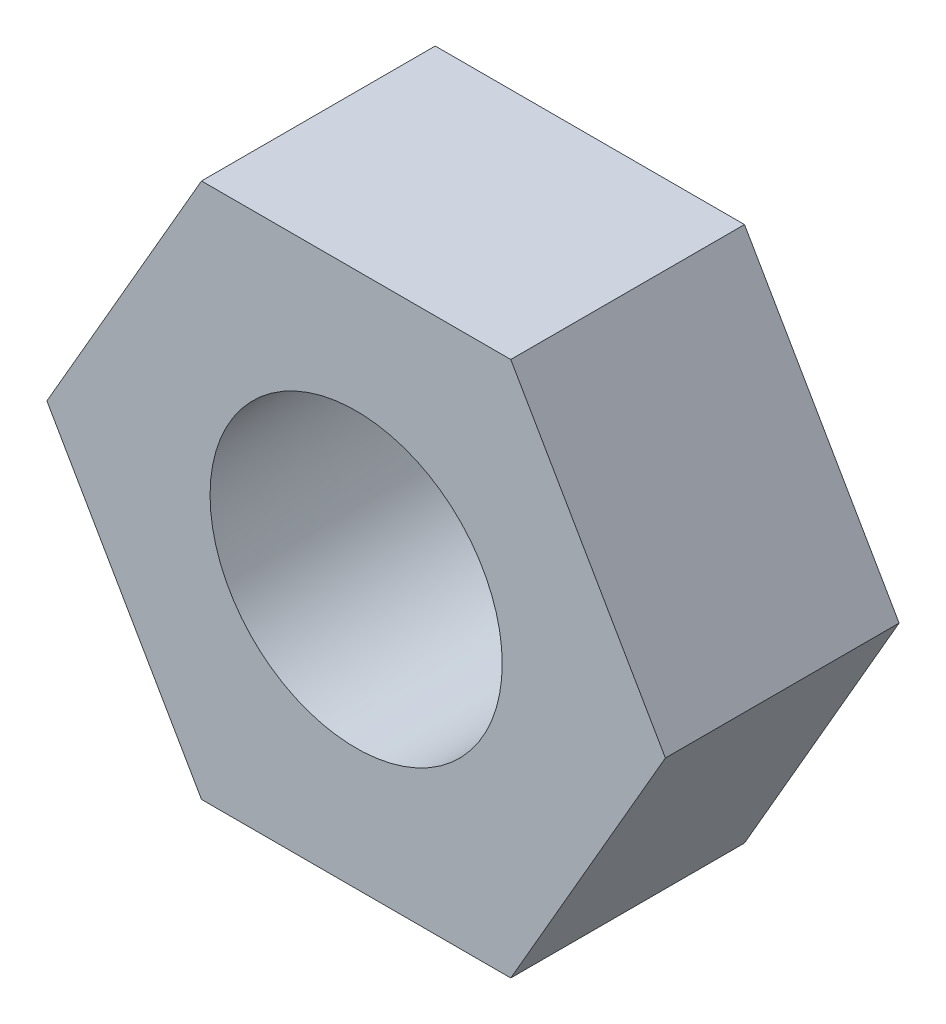
ISO-10303-21;
HEADER;
FILE_DESCRIPTION(('STEP AP214'),'2;1');
FILE_NAME('part.step','',(''),(''),'','','');
FILE_SCHEMA(('AUTOMOTIVE_DESIGN { 1 0 10303 214 1 1 1 1 }'));
ENDSEC;
DATA;
#1=APPLICATION_CONTEXT('core data for automotive mechanical design processes');
#2=APPLICATION_PROTOCOL_DEFINITION('international standard','automotive_design',2000,#1);
#3=PRODUCT_CONTEXT('',#1,'mechanical');
#4=PRODUCT('Part','Part','',(#3));
#5=PRODUCT_RELATED_PRODUCT_CATEGORY('part','',(#4));
#6=PRODUCT_DEFINITION_FORMATION('','',#4);
#7=PRODUCT_DEFINITION_CONTEXT('part definition',#1,'design');
#8=PRODUCT_DEFINITION('design','',#6,#7);
#9=PRODUCT_DEFINITION_SHAPE('','',#8);
#10=(LENGTH_UNIT() NAMED_UNIT(*) SI_UNIT(.MILLI.,.METRE.));
#11=(NAMED_UNIT(*) PLANE_ANGLE_UNIT() SI_UNIT($,.RADIAN.));
#12=(NAMED_UNIT(*) SI_UNIT($,.STERADIAN.) SOLID_ANGLE_UNIT());
#13=UNCERTAINTY_MEASURE_WITH_UNIT(LENGTH_MEASURE(1.E-05),#10,'distance_accuracy_value','');
#14=(GEOMETRIC_REPRESENTATION_CONTEXT(3) GLOBAL_UNCERTAINTY_ASSIGNED_CONTEXT((#13)) GLOBAL_UNIT_ASSIGNED_CONTEXT((#10,
#11,#12)) REPRESENTATION_CONTEXT('',''));
#15=CARTESIAN_POINT('',(0.,0.,0.));
#16=DIRECTION('',(0.,0.,1.));
#17=DIRECTION('',(1.,0.,0.));
#18=AXIS2_PLACEMENT_3D('',#15,#16,#17);
#19=CARTESIAN_POINT('',(0.,0.,2.4));
#20=DIRECTION('',(0.,0.,1.));
#21=DIRECTION('',(1.,0.,0.));
#22=AXIS2_PLACEMENT_3D('',#19,#20,#21);
#23=PLANE('',#22);
#24=DIRECTION('',(0.5,0.866025403784439,0.));
#25=VECTOR('',#24,1.);
#26=CARTESIAN_POINT('',(1.58771324027147,-2.75,2.4));
#27=LINE('',#26,#25);
#28=CARTESIAN_POINT('',(1.58771324027147,-2.75,2.4));
#29=VERTEX_POINT('',#28);
#30=CARTESIAN_POINT('',(3.17542648054294,0.,2.4));
#31=VERTEX_POINT('',#30);
#32=EDGE_CURVE('E140',#29,#31,#27,.T.);
#33=ORIENTED_EDGE('',*,*,#32,.T.);
#34=DIRECTION('',(-0.5,0.866025403784439,0.));
#35=VECTOR('',#34,1.);
#36=CARTESIAN_POINT('',(3.17542648054294,0.,2.4));
#37=LINE('',#36,#35);
#38=CARTESIAN_POINT('',(1.58771324027147,2.75,2.4));
#39=VERTEX_POINT('',#38);
#40=EDGE_CURVE('E91',#31,#39,#37,.T.);
#41=ORIENTED_EDGE('',*,*,#40,.T.);
#42=DIRECTION('',(-1.,0.,0.));
#43=VECTOR('',#42,1.);
#44=CARTESIAN_POINT('',(1.58771324027147,2.75,2.4));
#45=LINE('',#44,#43);
#46=CARTESIAN_POINT('',(-1.58771324027147,2.75,2.4));
#47=VERTEX_POINT('',#46);
#48=EDGE_CURVE('E108',#39,#47,#45,.T.);
#49=ORIENTED_EDGE('',*,*,#48,.T.);
#50=DIRECTION('',(-0.5,-0.866025403784438,0.));
#51=VECTOR('',#50,1.);
#52=CARTESIAN_POINT('',(-1.58771324027147,2.75,2.4));
#53=LINE('',#52,#51);
#54=CARTESIAN_POINT('',(-3.17542648054294,0.,2.4));
#55=VERTEX_POINT('',#54);
#56=EDGE_CURVE('E105',#47,#55,#53,.T.);
#57=ORIENTED_EDGE('',*,*,#56,.T.);
#58=DIRECTION('',(0.5,-0.866025403784439,0.));
#59=VECTOR('',#58,1.);
#60=CARTESIAN_POINT('',(-3.17542648054294,0.,2.4));
#61=LINE('',#60,#59);
#62=CARTESIAN_POINT('',(-1.58771324027147,-2.75,2.4));
#63=VERTEX_POINT('',#62);
#64=EDGE_CURVE('E106',#55,#63,#61,.T.);
#65=ORIENTED_EDGE('',*,*,#64,.T.);
#66=DIRECTION('',(1.,0.,0.));
#67=VECTOR('',#66,1.);
#68=CARTESIAN_POINT('',(-1.58771324027147,-2.75,2.4));
#69=LINE('',#68,#67);
#70=EDGE_CURVE('E59',#63,#29,#69,.T.);
#71=ORIENTED_EDGE('',*,*,#70,.T.);
#72=EDGE_LOOP('',(#33,#41,#49,#57,#65,#71));
#73=FACE_BOUND('',#72,.T.);
#74=CARTESIAN_POINT('',(0.,0.,2.4));
#75=DIRECTION('',(0.,0.,1.));
#76=DIRECTION('',(1.,0.,0.));
#77=AXIS2_PLACEMENT_3D('',#74,#75,#76);
#78=CIRCLE('',#77,1.5);
#79=CARTESIAN_POINT('',(1.5,0.,2.4));
#80=VERTEX_POINT('',#79);
#81=EDGE_CURVE('E127',#80,#80,#78,.T.);
#82=ORIENTED_EDGE('',*,*,#81,.F.);
#83=EDGE_LOOP('',(#82));
#84=FACE_BOUND('',#83,.T.);
#85=ADVANCED_FACE('F41',(#73,#84),#23,.T.);
#86=CARTESIAN_POINT('',(0.,0.,0.));
#87=DIRECTION('',(0.,0.,1.));
#88=DIRECTION('',(1.,0.,0.));
#89=AXIS2_PLACEMENT_3D('',#86,#87,#88);
#90=PLANE('',#89);
#91=DIRECTION('',(0.5,0.866025403784439,0.));
#92=VECTOR('',#91,1.);
#93=CARTESIAN_POINT('',(1.58771324027147,-2.75,0.));
#94=LINE('',#93,#92);
#95=CARTESIAN_POINT('',(1.58771324027147,-2.75,0.));
#96=VERTEX_POINT('',#95);
#97=CARTESIAN_POINT('',(3.17542648054294,0.,0.));
#98=VERTEX_POINT('',#97);
#99=EDGE_CURVE('E129',#96,#98,#94,.T.);
#100=ORIENTED_EDGE('',*,*,#99,.F.);
#101=DIRECTION('',(1.,0.,0.));
#102=VECTOR('',#101,1.);
#103=CARTESIAN_POINT('',(-1.58771324027147,-2.75,0.));
#104=LINE('',#103,#102);
#105=CARTESIAN_POINT('',(-1.58771324027147,-2.75,0.));
#106=VERTEX_POINT('',#105);
#107=EDGE_CURVE('E90',#106,#96,#104,.T.);
#108=ORIENTED_EDGE('',*,*,#107,.F.);
#109=DIRECTION('',(0.5,-0.866025403784439,0.));
#110=VECTOR('',#109,1.);
#111=CARTESIAN_POINT('',(-3.17542648054294,0.,0.));
#112=LINE('',#111,#110);
#113=CARTESIAN_POINT('',(-3.17542648054294,0.,0.));
#114=VERTEX_POINT('',#113);
#115=EDGE_CURVE('E84',#114,#106,#112,.T.);
#116=ORIENTED_EDGE('',*,*,#115,.F.);
#117=DIRECTION('',(-0.5,-0.866025403784438,0.));
#118=VECTOR('',#117,1.);
#119=CARTESIAN_POINT('',(-1.58771324027147,2.75,0.));
#120=LINE('',#119,#118);
#121=CARTESIAN_POINT('',(-1.58771324027147,2.75,0.));
#122=VERTEX_POINT('',#121);
#123=EDGE_CURVE('E116',#122,#114,#120,.T.);
#124=ORIENTED_EDGE('',*,*,#123,.F.);
#125=DIRECTION('',(-1.,0.,0.));
#126=VECTOR('',#125,1.);
#127=CARTESIAN_POINT('',(1.58771324027147,2.75,0.));
#128=LINE('',#127,#126);
#129=CARTESIAN_POINT('',(1.58771324027147,2.75,0.));
#130=VERTEX_POINT('',#129);
#131=EDGE_CURVE('E135',#130,#122,#128,.T.);
#132=ORIENTED_EDGE('',*,*,#131,.F.);
#133=DIRECTION('',(-0.5,0.866025403784439,0.));
#134=VECTOR('',#133,1.);
#135=CARTESIAN_POINT('',(3.17542648054294,0.,0.));
#136=LINE('',#135,#134);
#137=EDGE_CURVE('E128',#98,#130,#136,.T.);
#138=ORIENTED_EDGE('',*,*,#137,.F.);
#139=EDGE_LOOP('',(#100,#108,#116,#124,#132,#138));
#140=FACE_BOUND('',#139,.T.);
#141=CARTESIAN_POINT('',(0.,0.,0.));
#142=DIRECTION('',(0.,0.,1.));
#143=DIRECTION('',(1.,0.,0.));
#144=AXIS2_PLACEMENT_3D('',#141,#142,#143);
#145=CIRCLE('',#144,1.5);
#146=CARTESIAN_POINT('',(1.5,0.,0.));
#147=VERTEX_POINT('',#146);
#148=EDGE_CURVE('E229',#147,#147,#145,.T.);
#149=ORIENTED_EDGE('',*,*,#148,.T.);
#150=EDGE_LOOP('',(#149));
#151=FACE_BOUND('',#150,.T.);
#152=ADVANCED_FACE('F149',(#140,#151),#90,.F.);
#153=CARTESIAN_POINT('',(1.58771324027147,-2.75,2.4));
#154=DIRECTION('',(-0.866025403784439,0.5,0.));
#155=DIRECTION('',(-0.5,-0.866025403784439,0.));
#156=AXIS2_PLACEMENT_3D('',#153,#154,#155);
#157=PLANE('',#156);
#158=ORIENTED_EDGE('',*,*,#99,.T.);
#159=DIRECTION('',(0.,0.,-1.));
#160=VECTOR('',#159,1.);
#161=CARTESIAN_POINT('',(3.17542648054294,0.,2.4));
#162=LINE('',#161,#160);
#163=EDGE_CURVE('E11',#31,#98,#162,.T.);
#164=ORIENTED_EDGE('',*,*,#163,.F.);
#165=ORIENTED_EDGE('',*,*,#32,.F.);
#166=DIRECTION('',(0.,0.,-1.));
#167=VECTOR('',#166,1.);
#168=CARTESIAN_POINT('',(1.58771324027147,-2.75,2.4));
#169=LINE('',#168,#167);
#170=EDGE_CURVE('E125',#29,#96,#169,.T.);
#171=ORIENTED_EDGE('',*,*,#170,.T.);
#172=EDGE_LOOP('',(#158,#164,#165,#171));
#173=FACE_BOUND('',#172,.T.);
#174=ADVANCED_FACE('F43',(#173),#157,.F.);
#175=CARTESIAN_POINT('',(3.17542648054294,0.,2.4));
#176=DIRECTION('',(-0.866025403784439,-0.5,0.));
#177=DIRECTION('',(0.5,-0.866025403784439,0.));
#178=AXIS2_PLACEMENT_3D('',#175,#176,#177);
#179=PLANE('',#178);
#180=ORIENTED_EDGE('',*,*,#137,.T.);
#181=DIRECTION('',(0.,0.,-1.));
#182=VECTOR('',#181,1.);
#183=CARTESIAN_POINT('',(1.58771324027147,2.75,2.4));
#184=LINE('',#183,#182);
#185=EDGE_CURVE('E49',#39,#130,#184,.T.);
#186=ORIENTED_EDGE('',*,*,#185,.F.);
#187=ORIENTED_EDGE('',*,*,#40,.F.);
#188=ORIENTED_EDGE('',*,*,#163,.T.);
#189=EDGE_LOOP('',(#180,#186,#187,#188));
#190=FACE_BOUND('',#189,.T.);
#191=ADVANCED_FACE('F171',(#190),#179,.F.);
#192=CARTESIAN_POINT('',(1.58771324027147,2.75,2.4));
#193=DIRECTION('',(0.,-1.,0.));
#194=DIRECTION('',(1.,0.,0.));
#195=AXIS2_PLACEMENT_3D('',#192,#193,#194);
#196=PLANE('',#195);
#197=ORIENTED_EDGE('',*,*,#131,.T.);
#198=DIRECTION('',(0.,0.,-1.));
#199=VECTOR('',#198,1.);
#200=CARTESIAN_POINT('',(-1.58771324027147,2.75,2.4));
#201=LINE('',#200,#199);
#202=EDGE_CURVE('E120',#47,#122,#201,.T.);
#203=ORIENTED_EDGE('',*,*,#202,.F.);
#204=ORIENTED_EDGE('',*,*,#48,.F.);
#205=ORIENTED_EDGE('',*,*,#185,.T.);
#206=EDGE_LOOP('',(#197,#203,#204,#205));
#207=FACE_BOUND('',#206,.T.);
#208=ADVANCED_FACE('F141',(#207),#196,.F.);
#209=CARTESIAN_POINT('',(-1.58771324027147,2.75,2.4));
#210=DIRECTION('',(0.866025403784439,-0.5,0.));
#211=DIRECTION('',(0.5,0.866025403784439,0.));
#212=AXIS2_PLACEMENT_3D('',#209,#210,#211);
#213=PLANE('',#212);
#214=ORIENTED_EDGE('',*,*,#123,.T.);
#215=DIRECTION('',(0.,0.,-1.));
#216=VECTOR('',#215,1.);
#217=CARTESIAN_POINT('',(-3.17542648054294,0.,2.4));
#218=LINE('',#217,#216);
#219=EDGE_CURVE('E113',#55,#114,#218,.T.);
#220=ORIENTED_EDGE('',*,*,#219,.F.);
#221=ORIENTED_EDGE('',*,*,#56,.F.);
#222=ORIENTED_EDGE('',*,*,#202,.T.);
#223=EDGE_LOOP('',(#214,#220,#221,#222));
#224=FACE_BOUND('',#223,.T.);
#225=ADVANCED_FACE('F112',(#224),#213,.F.);
#226=CARTESIAN_POINT('',(-3.17542648054294,0.,2.4));
#227=DIRECTION('',(0.866025403784439,0.5,0.));
#228=DIRECTION('',(-0.5,0.866025403784439,0.));
#229=AXIS2_PLACEMENT_3D('',#226,#227,#228);
#230=PLANE('',#229);
#231=ORIENTED_EDGE('',*,*,#115,.T.);
#232=DIRECTION('',(0.,0.,-1.));
#233=VECTOR('',#232,1.);
#234=CARTESIAN_POINT('',(-1.58771324027147,-2.75,2.4));
#235=LINE('',#234,#233);
#236=EDGE_CURVE('E117',#63,#106,#235,.T.);
#237=ORIENTED_EDGE('',*,*,#236,.F.);
#238=ORIENTED_EDGE('',*,*,#64,.F.);
#239=ORIENTED_EDGE('',*,*,#219,.T.);
#240=EDGE_LOOP('',(#231,#237,#238,#239));
#241=FACE_BOUND('',#240,.T.);
#242=ADVANCED_FACE('F119',(#241),#230,.F.);
#243=CARTESIAN_POINT('',(-1.58771324027147,-2.75,2.4));
#244=DIRECTION('',(0.,1.,0.));
#245=DIRECTION('',(-1.,0.,0.));
#246=AXIS2_PLACEMENT_3D('',#243,#244,#245);
#247=PLANE('',#246);
#248=ORIENTED_EDGE('',*,*,#107,.T.);
#249=ORIENTED_EDGE('',*,*,#170,.F.);
#250=ORIENTED_EDGE('',*,*,#70,.F.);
#251=ORIENTED_EDGE('',*,*,#236,.T.);
#252=EDGE_LOOP('',(#248,#249,#250,#251));
#253=FACE_BOUND('',#252,.T.);
#254=ADVANCED_FACE('F152',(#253),#247,.F.);
#255=CARTESIAN_POINT('',(0.,0.,2.4));
#256=DIRECTION('',(0.,0.,-1.));
#257=DIRECTION('',(-1.,0.,0.));
#258=AXIS2_PLACEMENT_3D('',#255,#256,#257);
#259=CYLINDRICAL_SURFACE('',#258,1.5);
#260=ORIENTED_EDGE('',*,*,#81,.T.);
#261=EDGE_LOOP('',(#260));
#262=FACE_BOUND('',#261,.T.);
#263=ORIENTED_EDGE('',*,*,#148,.F.);
#264=EDGE_LOOP('',(#263));
#265=FACE_BOUND('',#264,.T.);
#266=ADVANCED_FACE('F154',(#262,#265),#259,.F.);
#267=CLOSED_SHELL('',(#85,#152,#174,#191,#208,#225,#242,#254,#266));
#268=MANIFOLD_SOLID_BREP('B2',#267);
#269=ADVANCED_BREP_SHAPE_REPRESENTATION('',(#18,#268),#14);
#270=SHAPE_DEFINITION_REPRESENTATION(#9,#269);
ENDSEC;
END-ISO-10303-21;
